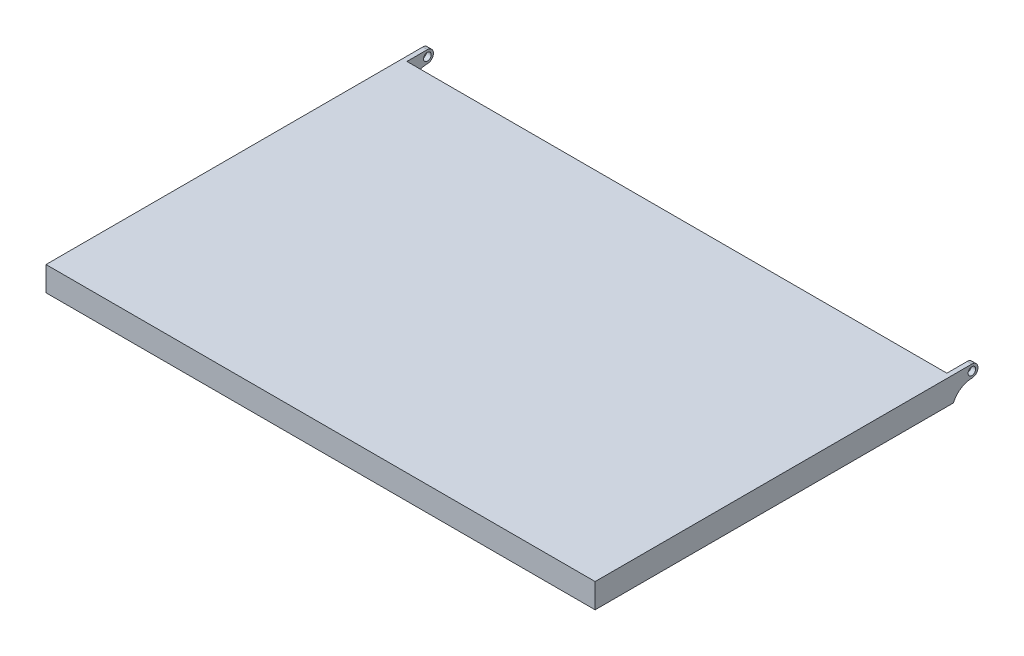
ISO-10303-21;
HEADER;
FILE_DESCRIPTION(('STEP AP214'),'2;1');
FILE_NAME('part.step','',(''),(''),'','','');
FILE_SCHEMA(('AUTOMOTIVE_DESIGN { 1 0 10303 214 1 1 1 1 }'));
ENDSEC;
DATA;
#1=APPLICATION_CONTEXT('core data for automotive mechanical design processes');
#2=APPLICATION_PROTOCOL_DEFINITION('international standard','automotive_design',2000,#1);
#3=PRODUCT_CONTEXT('',#1,'mechanical');
#4=PRODUCT('Part','Part','',(#3));
#5=PRODUCT_RELATED_PRODUCT_CATEGORY('part','',(#4));
#6=PRODUCT_DEFINITION_FORMATION('','',#4);
#7=PRODUCT_DEFINITION_CONTEXT('part definition',#1,'design');
#8=PRODUCT_DEFINITION('design','',#6,#7);
#9=PRODUCT_DEFINITION_SHAPE('','',#8);
#10=(LENGTH_UNIT() NAMED_UNIT(*) SI_UNIT(.MILLI.,.METRE.));
#11=(NAMED_UNIT(*) PLANE_ANGLE_UNIT() SI_UNIT($,.RADIAN.));
#12=(NAMED_UNIT(*) SI_UNIT($,.STERADIAN.) SOLID_ANGLE_UNIT());
#13=UNCERTAINTY_MEASURE_WITH_UNIT(LENGTH_MEASURE(1.E-05),#10,'distance_accuracy_value','');
#14=(GEOMETRIC_REPRESENTATION_CONTEXT(3) GLOBAL_UNCERTAINTY_ASSIGNED_CONTEXT((#13)) GLOBAL_UNIT_ASSIGNED_CONTEXT((#10,
#11,#12)) REPRESENTATION_CONTEXT('',''));
#15=CARTESIAN_POINT('',(0.,0.,0.));
#16=DIRECTION('',(0.,0.,1.));
#17=DIRECTION('',(1.,0.,0.));
#18=AXIS2_PLACEMENT_3D('',#15,#16,#17);
#19=CARTESIAN_POINT('',(42.3333333333333,25.4,-411.818666666667));
#20=DIRECTION('',(0.,0.,1.));
#21=DIRECTION('',(1.,0.,0.));
#22=AXIS2_PLACEMENT_3D('',#19,#20,#21);
#23=PLANE('',#22);
#24=DIRECTION('',(0.,-1.,0.));
#25=VECTOR('',#24,1.);
#26=CARTESIAN_POINT('',(47.0958333333333,0.,-411.818666666667));
#27=LINE('',#26,#25);
#28=CARTESIAN_POINT('',(47.0958333333333,25.4,-411.818666666667));
#29=VERTEX_POINT('',#28);
#30=CARTESIAN_POINT('',(47.0958333333333,0.,-411.818666666667));
#31=VERTEX_POINT('',#30);
#32=EDGE_CURVE('E168',#29,#31,#27,.T.);
#33=ORIENTED_EDGE('',*,*,#32,.F.);
#34=DIRECTION('',(-1.,0.,0.));
#35=VECTOR('',#34,1.);
#36=CARTESIAN_POINT('',(42.3333333333333,25.4,-411.818666666667));
#37=LINE('',#36,#35);
#38=CARTESIAN_POINT('',(606.954166666667,25.4,-411.818666666667));
#39=VERTEX_POINT('',#38);
#40=EDGE_CURVE('E174',#39,#29,#37,.T.);
#41=ORIENTED_EDGE('',*,*,#40,.F.);
#42=DIRECTION('',(0.,-1.,0.));
#43=VECTOR('',#42,1.);
#44=CARTESIAN_POINT('',(606.954166666667,0.,-411.818666666667));
#45=LINE('',#44,#43);
#46=CARTESIAN_POINT('',(606.954166666667,0.,-411.818666666667));
#47=VERTEX_POINT('',#46);
#48=EDGE_CURVE('E201',#39,#47,#45,.T.);
#49=ORIENTED_EDGE('',*,*,#48,.T.);
#50=DIRECTION('',(-1.,0.,0.));
#51=VECTOR('',#50,1.);
#52=CARTESIAN_POINT('',(42.3333333333333,0.,-411.818666666667));
#53=LINE('',#52,#51);
#54=EDGE_CURVE('E255',#47,#31,#53,.T.);
#55=ORIENTED_EDGE('',*,*,#54,.T.);
#56=EDGE_LOOP('',(#33,#41,#49,#55));
#57=FACE_BOUND('',#56,.T.);
#58=ADVANCED_FACE('F44',(#57),#23,.F.);
#59=CARTESIAN_POINT('',(0.,0.,0.));
#60=DIRECTION('',(0.,-1.,0.));
#61=DIRECTION('',(0.,0.,-1.));
#62=AXIS2_PLACEMENT_3D('',#59,#60,#61);
#63=PLANE('',#62);
#64=DIRECTION('',(0.,0.,1.));
#65=VECTOR('',#64,1.);
#66=CARTESIAN_POINT('',(42.3333333333333,0.,-42.3333333333333));
#67=LINE('',#66,#65);
#68=CARTESIAN_POINT('',(42.3333333333333,0.,-413.933666666667));
#69=VERTEX_POINT('',#68);
#70=CARTESIAN_POINT('',(42.3333333333333,0.,-42.3333333333333));
#71=VERTEX_POINT('',#70);
#72=EDGE_CURVE('E227',#69,#71,#67,.T.);
#73=ORIENTED_EDGE('',*,*,#72,.F.);
#74=DIRECTION('',(-1.,0.,0.));
#75=VECTOR('',#74,1.);
#76=CARTESIAN_POINT('',(47.0958333333333,0.,-413.933666666667));
#77=LINE('',#76,#75);
#78=CARTESIAN_POINT('',(47.0958333333333,0.,-413.933666666667));
#79=VERTEX_POINT('',#78);
#80=EDGE_CURVE('E188',#79,#69,#77,.T.);
#81=ORIENTED_EDGE('',*,*,#80,.F.);
#82=DIRECTION('',(0.,0.,-1.));
#83=VECTOR('',#82,1.);
#84=CARTESIAN_POINT('',(47.0958333333333,0.,-411.818666666667));
#85=LINE('',#84,#83);
#86=EDGE_CURVE('E183',#31,#79,#85,.T.);
#87=ORIENTED_EDGE('',*,*,#86,.F.);
#88=ORIENTED_EDGE('',*,*,#54,.F.);
#89=DIRECTION('',(0.,0.,-1.));
#90=VECTOR('',#89,1.);
#91=CARTESIAN_POINT('',(606.954166666667,0.,-411.818666666667));
#92=LINE('',#91,#90);
#93=CARTESIAN_POINT('',(606.954166666667,0.,-413.933666666667));
#94=VERTEX_POINT('',#93);
#95=EDGE_CURVE('E59',#47,#94,#92,.T.);
#96=ORIENTED_EDGE('',*,*,#95,.T.);
#97=DIRECTION('',(1.,0.,0.));
#98=VECTOR('',#97,1.);
#99=CARTESIAN_POINT('',(606.954166666667,0.,-413.933666666667));
#100=LINE('',#99,#98);
#101=CARTESIAN_POINT('',(611.716666666667,0.,-413.933666666667));
#102=VERTEX_POINT('',#101);
#103=EDGE_CURVE('E211',#94,#102,#100,.T.);
#104=ORIENTED_EDGE('',*,*,#103,.T.);
#105=DIRECTION('',(0.,0.,-1.));
#106=VECTOR('',#105,1.);
#107=CARTESIAN_POINT('',(611.716666666667,0.,-42.3333333333333));
#108=LINE('',#107,#106);
#109=CARTESIAN_POINT('',(611.716666666667,0.,-42.3333333333333));
#110=VERTEX_POINT('',#109);
#111=EDGE_CURVE('E264',#110,#102,#108,.T.);
#112=ORIENTED_EDGE('',*,*,#111,.F.);
#113=DIRECTION('',(1.,0.,0.));
#114=VECTOR('',#113,1.);
#115=CARTESIAN_POINT('',(42.3333333333333,0.,-42.3333333333333));
#116=LINE('',#115,#114);
#117=EDGE_CURVE('E262',#71,#110,#116,.T.);
#118=ORIENTED_EDGE('',*,*,#117,.F.);
#119=EDGE_LOOP('',(#73,#81,#87,#88,#96,#104,#112,#118));
#120=FACE_BOUND('',#119,.T.);
#121=DIRECTION('',(-1.,0.,0.));
#122=VECTOR('',#121,1.);
#123=CARTESIAN_POINT('',(0.,0.,-408.643666666667));
#124=LINE('',#123,#122);
#125=CARTESIAN_POINT('',(608.541666666667,0.,-408.643666666667));
#126=VERTEX_POINT('',#125);
#127=CARTESIAN_POINT('',(45.5083333333333,0.,-408.643666666667));
#128=VERTEX_POINT('',#127);
#129=EDGE_CURVE('E233',#126,#128,#124,.T.);
#130=ORIENTED_EDGE('',*,*,#129,.T.);
#131=DIRECTION('',(0.,0.,1.));
#132=VECTOR('',#131,1.);
#133=CARTESIAN_POINT('',(45.5083333333333,0.,0.));
#134=LINE('',#133,#132);
#135=CARTESIAN_POINT('',(45.5083333333333,0.,-45.5083333333333));
#136=VERTEX_POINT('',#135);
#137=EDGE_CURVE('E219',#128,#136,#134,.T.);
#138=ORIENTED_EDGE('',*,*,#137,.T.);
#139=DIRECTION('',(1.,0.,0.));
#140=VECTOR('',#139,1.);
#141=CARTESIAN_POINT('',(0.,0.,-45.5083333333333));
#142=LINE('',#141,#140);
#143=CARTESIAN_POINT('',(608.541666666667,0.,-45.5083333333333));
#144=VERTEX_POINT('',#143);
#145=EDGE_CURVE('E246',#136,#144,#142,.T.);
#146=ORIENTED_EDGE('',*,*,#145,.T.);
#147=DIRECTION('',(0.,0.,-1.));
#148=VECTOR('',#147,1.);
#149=CARTESIAN_POINT('',(608.541666666667,0.,0.));
#150=LINE('',#149,#148);
#151=EDGE_CURVE('E67',#144,#126,#150,.T.);
#152=ORIENTED_EDGE('',*,*,#151,.T.);
#153=EDGE_LOOP('',(#130,#138,#146,#152));
#154=FACE_BOUND('',#153,.T.);
#155=ADVANCED_FACE('F276',(#120,#154),#63,.T.);
#156=CARTESIAN_POINT('',(42.3333333333333,25.4,-42.3333333333333));
#157=DIRECTION('',(1.,0.,0.));
#158=DIRECTION('',(0.,0.,-1.));
#159=AXIS2_PLACEMENT_3D('',#156,#157,#158);
#160=PLANE('',#159);
#161=ORIENTED_EDGE('',*,*,#72,.T.);
#162=DIRECTION('',(0.,-1.,0.));
#163=VECTOR('',#162,1.);
#164=CARTESIAN_POINT('',(42.3333333333333,25.4,-42.3333333333333));
#165=LINE('',#164,#163);
#166=CARTESIAN_POINT('',(42.3333333333333,25.4,-42.3333333333333));
#167=VERTEX_POINT('',#166);
#168=EDGE_CURVE('E11',#167,#71,#165,.T.);
#169=ORIENTED_EDGE('',*,*,#168,.F.);
#170=DIRECTION('',(0.,0.,1.));
#171=VECTOR('',#170,1.);
#172=CARTESIAN_POINT('',(42.3333333333333,25.4,-42.3333333333333));
#173=LINE('',#172,#171);
#174=CARTESIAN_POINT('',(42.3333333333333,25.4,-432.983666666667));
#175=VERTEX_POINT('',#174);
#176=EDGE_CURVE('E252',#175,#167,#173,.T.);
#177=ORIENTED_EDGE('',*,*,#176,.F.);
#178=CARTESIAN_POINT('',(42.3333333333333,19.05,-432.983666666667));
#179=DIRECTION('',(1.,0.,0.));
#180=DIRECTION('',(0.,0.,-1.));
#181=AXIS2_PLACEMENT_3D('',#178,#179,#180);
#182=CIRCLE('',#181,6.35);
#183=CARTESIAN_POINT('',(42.3333333333333,12.7,-432.983666666667));
#184=VERTEX_POINT('',#183);
#185=EDGE_CURVE('E164',#184,#175,#182,.T.);
#186=ORIENTED_EDGE('',*,*,#185,.F.);
#187=CARTESIAN_POINT('',(42.3333333333333,-7.93750000000025,-432.983666666667));
#188=DIRECTION('',(-1.,0.,0.));
#189=DIRECTION('',(0.,0.,1.));
#190=AXIS2_PLACEMENT_3D('',#187,#188,#189);
#191=CIRCLE('',#190,20.6375000000003);
#192=EDGE_CURVE('E175',#69,#184,#191,.T.);
#193=ORIENTED_EDGE('',*,*,#192,.F.);
#194=EDGE_LOOP('',(#161,#169,#177,#186,#193));
#195=FACE_BOUND('',#194,.T.);
#196=CARTESIAN_POINT('',(42.3333333333333,19.05,-432.983666666667));
#197=DIRECTION('',(1.,0.,0.));
#198=DIRECTION('',(0.,0.,-1.));
#199=AXIS2_PLACEMENT_3D('',#196,#197,#198);
#200=CIRCLE('',#199,3.96875000000005);
#201=CARTESIAN_POINT('',(42.3333333333333,19.05,-429.014916666667));
#202=VERTEX_POINT('',#201);
#203=EDGE_CURVE('E179',#202,#202,#200,.T.);
#204=ORIENTED_EDGE('',*,*,#203,.T.);
#205=EDGE_LOOP('',(#204));
#206=FACE_BOUND('',#205,.T.);
#207=ADVANCED_FACE('F46',(#195,#206),#160,.F.);
#208=CARTESIAN_POINT('',(42.3333333333333,25.4,-42.3333333333333));
#209=DIRECTION('',(0.,0.,-1.));
#210=DIRECTION('',(-1.,0.,0.));
#211=AXIS2_PLACEMENT_3D('',#208,#209,#210);
#212=PLANE('',#211);
#213=ORIENTED_EDGE('',*,*,#117,.T.);
#214=DIRECTION('',(0.,-1.,0.));
#215=VECTOR('',#214,1.);
#216=CARTESIAN_POINT('',(611.716666666667,25.4,-42.3333333333333));
#217=LINE('',#216,#215);
#218=CARTESIAN_POINT('',(611.716666666667,25.4,-42.3333333333333));
#219=VERTEX_POINT('',#218);
#220=EDGE_CURVE('E52',#219,#110,#217,.T.);
#221=ORIENTED_EDGE('',*,*,#220,.F.);
#222=DIRECTION('',(1.,0.,0.));
#223=VECTOR('',#222,1.);
#224=CARTESIAN_POINT('',(42.3333333333333,25.4,-42.3333333333333));
#225=LINE('',#224,#223);
#226=EDGE_CURVE('E254',#167,#219,#225,.T.);
#227=ORIENTED_EDGE('',*,*,#226,.F.);
#228=ORIENTED_EDGE('',*,*,#168,.T.);
#229=EDGE_LOOP('',(#213,#221,#227,#228));
#230=FACE_BOUND('',#229,.T.);
#231=ADVANCED_FACE('F297',(#230),#212,.F.);
#232=CARTESIAN_POINT('',(611.716666666667,25.4,-42.3333333333333));
#233=DIRECTION('',(-1.,0.,0.));
#234=DIRECTION('',(0.,0.,1.));
#235=AXIS2_PLACEMENT_3D('',#232,#233,#234);
#236=PLANE('',#235);
#237=ORIENTED_EDGE('',*,*,#111,.T.);
#238=CARTESIAN_POINT('',(611.716666666667,-7.93750000000025,-432.983666666667));
#239=DIRECTION('',(-1.,0.,0.));
#240=DIRECTION('',(0.,0.,1.));
#241=AXIS2_PLACEMENT_3D('',#238,#239,#240);
#242=CIRCLE('',#241,20.6375000000003);
#243=CARTESIAN_POINT('',(611.716666666667,12.7,-432.983666666667));
#244=VERTEX_POINT('',#243);
#245=EDGE_CURVE('E196',#102,#244,#242,.T.);
#246=ORIENTED_EDGE('',*,*,#245,.T.);
#247=CARTESIAN_POINT('',(611.716666666667,19.05,-432.983666666667));
#248=DIRECTION('',(1.,0.,0.));
#249=DIRECTION('',(0.,0.,-1.));
#250=AXIS2_PLACEMENT_3D('',#247,#248,#249);
#251=CIRCLE('',#250,6.35);
#252=CARTESIAN_POINT('',(611.716666666667,25.4,-432.983666666667));
#253=VERTEX_POINT('',#252);
#254=EDGE_CURVE('E202',#244,#253,#251,.T.);
#255=ORIENTED_EDGE('',*,*,#254,.T.);
#256=DIRECTION('',(0.,0.,-1.));
#257=VECTOR('',#256,1.);
#258=CARTESIAN_POINT('',(611.716666666667,25.4,-42.3333333333333));
#259=LINE('',#258,#257);
#260=EDGE_CURVE('E257',#219,#253,#259,.T.);
#261=ORIENTED_EDGE('',*,*,#260,.F.);
#262=ORIENTED_EDGE('',*,*,#220,.T.);
#263=EDGE_LOOP('',(#237,#246,#255,#261,#262));
#264=FACE_BOUND('',#263,.T.);
#265=CARTESIAN_POINT('',(611.716666666667,19.05,-432.983666666667));
#266=DIRECTION('',(1.,0.,0.));
#267=DIRECTION('',(0.,0.,-1.));
#268=AXIS2_PLACEMENT_3D('',#265,#266,#267);
#269=CIRCLE('',#268,3.96875000000005);
#270=CARTESIAN_POINT('',(611.716666666667,19.05,-436.952416666667));
#271=VERTEX_POINT('',#270);
#272=EDGE_CURVE('E191',#271,#271,#269,.T.);
#273=ORIENTED_EDGE('',*,*,#272,.F.);
#274=EDGE_LOOP('',(#273));
#275=FACE_BOUND('',#274,.T.);
#276=ADVANCED_FACE('F272',(#264,#275),#236,.F.);
#277=CARTESIAN_POINT('',(0.,25.4,0.));
#278=DIRECTION('',(0.,-1.,0.));
#279=DIRECTION('',(0.,0.,-1.));
#280=AXIS2_PLACEMENT_3D('',#277,#278,#279);
#281=PLANE('',#280);
#282=ORIENTED_EDGE('',*,*,#176,.T.);
#283=ORIENTED_EDGE('',*,*,#226,.T.);
#284=ORIENTED_EDGE('',*,*,#260,.T.);
#285=DIRECTION('',(1.,0.,0.));
#286=VECTOR('',#285,1.);
#287=CARTESIAN_POINT('',(606.954166666667,25.4,-432.983666666667));
#288=LINE('',#287,#286);
#289=CARTESIAN_POINT('',(606.954166666667,25.4,-432.983666666667));
#290=VERTEX_POINT('',#289);
#291=EDGE_CURVE('E216',#290,#253,#288,.T.);
#292=ORIENTED_EDGE('',*,*,#291,.F.);
#293=DIRECTION('',(0.,0.,1.));
#294=VECTOR('',#293,1.);
#295=CARTESIAN_POINT('',(606.954166666667,25.4,-411.818666666667));
#296=LINE('',#295,#294);
#297=EDGE_CURVE('E199',#290,#39,#296,.T.);
#298=ORIENTED_EDGE('',*,*,#297,.T.);
#299=ORIENTED_EDGE('',*,*,#40,.T.);
#300=DIRECTION('',(0.,0.,1.));
#301=VECTOR('',#300,1.);
#302=CARTESIAN_POINT('',(47.0958333333333,25.4,-411.818666666667));
#303=LINE('',#302,#301);
#304=CARTESIAN_POINT('',(47.0958333333333,25.4,-432.983666666667));
#305=VERTEX_POINT('',#304);
#306=EDGE_CURVE('E151',#305,#29,#303,.T.);
#307=ORIENTED_EDGE('',*,*,#306,.F.);
#308=DIRECTION('',(-1.,0.,0.));
#309=VECTOR('',#308,1.);
#310=CARTESIAN_POINT('',(47.0958333333333,25.4,-432.983666666667));
#311=LINE('',#310,#309);
#312=EDGE_CURVE('E161',#305,#175,#311,.T.);
#313=ORIENTED_EDGE('',*,*,#312,.T.);
#314=EDGE_LOOP('',(#282,#283,#284,#292,#298,#299,#307,#313));
#315=FACE_BOUND('',#314,.T.);
#316=ADVANCED_FACE('F171',(#315),#281,.F.);
#317=CARTESIAN_POINT('',(45.5083333333333,25.4,-42.3333333333333));
#318=DIRECTION('',(1.,0.,0.));
#319=DIRECTION('',(0.,0.,-1.));
#320=AXIS2_PLACEMENT_3D('',#317,#318,#319);
#321=PLANE('',#320);
#322=ORIENTED_EDGE('',*,*,#137,.F.);
#323=DIRECTION('',(0.,-1.,0.));
#324=VECTOR('',#323,1.);
#325=CARTESIAN_POINT('',(45.5083333333333,25.4,-408.643666666667));
#326=LINE('',#325,#324);
#327=CARTESIAN_POINT('',(45.5083333333333,22.225,-408.643666666667));
#328=VERTEX_POINT('',#327);
#329=EDGE_CURVE('E234',#328,#128,#326,.T.);
#330=ORIENTED_EDGE('',*,*,#329,.F.);
#331=DIRECTION('',(0.,0.,1.));
#332=VECTOR('',#331,1.);
#333=CARTESIAN_POINT('',(45.5083333333333,22.225,0.));
#334=LINE('',#333,#332);
#335=CARTESIAN_POINT('',(45.5083333333333,22.225,-45.5083333333333));
#336=VERTEX_POINT('',#335);
#337=EDGE_CURVE('E229',#328,#336,#334,.T.);
#338=ORIENTED_EDGE('',*,*,#337,.T.);
#339=DIRECTION('',(0.,-1.,0.));
#340=VECTOR('',#339,1.);
#341=CARTESIAN_POINT('',(45.5083333333333,25.4,-45.5083333333333));
#342=LINE('',#341,#340);
#343=EDGE_CURVE('E224',#336,#136,#342,.T.);
#344=ORIENTED_EDGE('',*,*,#343,.T.);
#345=EDGE_LOOP('',(#322,#330,#338,#344));
#346=FACE_BOUND('',#345,.T.);
#347=ADVANCED_FACE('F313',(#346),#321,.T.);
#348=CARTESIAN_POINT('',(42.3333333333333,25.4,-45.5083333333333));
#349=DIRECTION('',(0.,0.,-1.));
#350=DIRECTION('',(-1.,0.,0.));
#351=AXIS2_PLACEMENT_3D('',#348,#349,#350);
#352=PLANE('',#351);
#353=ORIENTED_EDGE('',*,*,#145,.F.);
#354=ORIENTED_EDGE('',*,*,#343,.F.);
#355=DIRECTION('',(1.,0.,0.));
#356=VECTOR('',#355,1.);
#357=CARTESIAN_POINT('',(0.,22.225,-45.5083333333333));
#358=LINE('',#357,#356);
#359=CARTESIAN_POINT('',(608.541666666667,22.225,-45.5083333333333));
#360=VERTEX_POINT('',#359);
#361=EDGE_CURVE('E232',#336,#360,#358,.T.);
#362=ORIENTED_EDGE('',*,*,#361,.T.);
#363=DIRECTION('',(0.,-1.,0.));
#364=VECTOR('',#363,1.);
#365=CARTESIAN_POINT('',(608.541666666667,25.4,-45.5083333333333));
#366=LINE('',#365,#364);
#367=EDGE_CURVE('E228',#360,#144,#366,.T.);
#368=ORIENTED_EDGE('',*,*,#367,.T.);
#369=EDGE_LOOP('',(#353,#354,#362,#368));
#370=FACE_BOUND('',#369,.T.);
#371=ADVANCED_FACE('F325',(#370),#352,.T.);
#372=CARTESIAN_POINT('',(608.541666666667,25.4,-42.3333333333333));
#373=DIRECTION('',(-1.,0.,0.));
#374=DIRECTION('',(0.,0.,1.));
#375=AXIS2_PLACEMENT_3D('',#372,#373,#374);
#376=PLANE('',#375);
#377=ORIENTED_EDGE('',*,*,#151,.F.);
#378=ORIENTED_EDGE('',*,*,#367,.F.);
#379=DIRECTION('',(0.,0.,-1.));
#380=VECTOR('',#379,1.);
#381=CARTESIAN_POINT('',(608.541666666667,22.225,0.));
#382=LINE('',#381,#380);
#383=CARTESIAN_POINT('',(608.541666666667,22.225,-408.643666666667));
#384=VERTEX_POINT('',#383);
#385=EDGE_CURVE('E240',#360,#384,#382,.T.);
#386=ORIENTED_EDGE('',*,*,#385,.T.);
#387=DIRECTION('',(0.,-1.,0.));
#388=VECTOR('',#387,1.);
#389=CARTESIAN_POINT('',(608.541666666667,25.4,-408.643666666667));
#390=LINE('',#389,#388);
#391=EDGE_CURVE('E236',#384,#126,#390,.T.);
#392=ORIENTED_EDGE('',*,*,#391,.T.);
#393=EDGE_LOOP('',(#377,#378,#386,#392));
#394=FACE_BOUND('',#393,.T.);
#395=ADVANCED_FACE('F321',(#394),#376,.T.);
#396=CARTESIAN_POINT('',(42.3333333333333,25.4,-408.643666666667));
#397=DIRECTION('',(0.,0.,1.));
#398=DIRECTION('',(1.,0.,0.));
#399=AXIS2_PLACEMENT_3D('',#396,#397,#398);
#400=PLANE('',#399);
#401=ORIENTED_EDGE('',*,*,#129,.F.);
#402=ORIENTED_EDGE('',*,*,#391,.F.);
#403=DIRECTION('',(-1.,0.,0.));
#404=VECTOR('',#403,1.);
#405=CARTESIAN_POINT('',(0.,22.225,-408.643666666667));
#406=LINE('',#405,#404);
#407=EDGE_CURVE('E237',#384,#328,#406,.T.);
#408=ORIENTED_EDGE('',*,*,#407,.T.);
#409=ORIENTED_EDGE('',*,*,#329,.T.);
#410=EDGE_LOOP('',(#401,#402,#408,#409));
#411=FACE_BOUND('',#410,.T.);
#412=ADVANCED_FACE('F317',(#411),#400,.T.);
#413=CARTESIAN_POINT('',(0.,22.225,0.));
#414=DIRECTION('',(0.,-1.,0.));
#415=DIRECTION('',(0.,0.,-1.));
#416=AXIS2_PLACEMENT_3D('',#413,#414,#415);
#417=PLANE('',#416);
#418=ORIENTED_EDGE('',*,*,#337,.F.);
#419=ORIENTED_EDGE('',*,*,#407,.F.);
#420=ORIENTED_EDGE('',*,*,#385,.F.);
#421=ORIENTED_EDGE('',*,*,#361,.F.);
#422=EDGE_LOOP('',(#418,#419,#420,#421));
#423=FACE_BOUND('',#422,.T.);
#424=ADVANCED_FACE('F314',(#423),#417,.T.);
#425=CARTESIAN_POINT('',(606.954166666667,19.05,-432.983666666667));
#426=DIRECTION('',(1.,0.,0.));
#427=DIRECTION('',(0.,0.,-1.));
#428=AXIS2_PLACEMENT_3D('',#425,#426,#427);
#429=CYLINDRICAL_SURFACE('',#428,6.35);
#430=ORIENTED_EDGE('',*,*,#254,.F.);
#431=DIRECTION('',(1.,0.,0.));
#432=VECTOR('',#431,1.);
#433=CARTESIAN_POINT('',(606.954166666667,12.7,-432.983666666667));
#434=LINE('',#433,#432);
#435=CARTESIAN_POINT('',(606.954166666667,12.7,-432.983666666667));
#436=VERTEX_POINT('',#435);
#437=EDGE_CURVE('E220',#436,#244,#434,.T.);
#438=ORIENTED_EDGE('',*,*,#437,.F.);
#439=CARTESIAN_POINT('',(606.954166666667,19.05,-432.983666666667));
#440=DIRECTION('',(1.,0.,0.));
#441=DIRECTION('',(0.,0.,-1.));
#442=AXIS2_PLACEMENT_3D('',#439,#440,#441);
#443=CIRCLE('',#442,6.35);
#444=EDGE_CURVE('E208',#436,#290,#443,.T.);
#445=ORIENTED_EDGE('',*,*,#444,.T.);
#446=ORIENTED_EDGE('',*,*,#291,.T.);
#447=EDGE_LOOP('',(#430,#438,#445,#446));
#448=FACE_BOUND('',#447,.T.);
#449=ADVANCED_FACE('F284',(#448),#429,.T.);
#450=CARTESIAN_POINT('',(606.954166666667,-7.93750000000025,-432.983666666667));
#451=DIRECTION('',(1.,0.,0.));
#452=DIRECTION('',(0.,0.,-1.));
#453=AXIS2_PLACEMENT_3D('',#450,#451,#452);
#454=CYLINDRICAL_SURFACE('',#453,20.6375000000003);
#455=ORIENTED_EDGE('',*,*,#245,.F.);
#456=ORIENTED_EDGE('',*,*,#103,.F.);
#457=CARTESIAN_POINT('',(606.954166666667,-7.93750000000025,-432.983666666667));
#458=DIRECTION('',(-1.,0.,0.));
#459=DIRECTION('',(0.,0.,1.));
#460=AXIS2_PLACEMENT_3D('',#457,#458,#459);
#461=CIRCLE('',#460,20.6375000000003);
#462=EDGE_CURVE('E205',#94,#436,#461,.T.);
#463=ORIENTED_EDGE('',*,*,#462,.T.);
#464=ORIENTED_EDGE('',*,*,#437,.T.);
#465=EDGE_LOOP('',(#455,#456,#463,#464));
#466=FACE_BOUND('',#465,.T.);
#467=ADVANCED_FACE('F281',(#466),#454,.F.);
#468=CARTESIAN_POINT('',(606.954166666667,19.05,-432.983666666667));
#469=DIRECTION('',(1.,0.,0.));
#470=DIRECTION('',(0.,0.,-1.));
#471=AXIS2_PLACEMENT_3D('',#468,#469,#470);
#472=PLANE('',#471);
#473=CARTESIAN_POINT('',(606.954166666667,19.05,-432.983666666667));
#474=DIRECTION('',(1.,0.,0.));
#475=DIRECTION('',(0.,0.,-1.));
#476=AXIS2_PLACEMENT_3D('',#473,#474,#475);
#477=CIRCLE('',#476,3.96875000000005);
#478=CARTESIAN_POINT('',(606.954166666667,19.05,-436.952416666667));
#479=VERTEX_POINT('',#478);
#480=EDGE_CURVE('E193',#479,#479,#477,.T.);
#481=ORIENTED_EDGE('',*,*,#480,.T.);
#482=EDGE_LOOP('',(#481));
#483=FACE_BOUND('',#482,.T.);
#484=ORIENTED_EDGE('',*,*,#297,.F.);
#485=ORIENTED_EDGE('',*,*,#444,.F.);
#486=ORIENTED_EDGE('',*,*,#462,.F.);
#487=ORIENTED_EDGE('',*,*,#95,.F.);
#488=ORIENTED_EDGE('',*,*,#48,.F.);
#489=EDGE_LOOP('',(#484,#485,#486,#487,#488));
#490=FACE_BOUND('',#489,.T.);
#491=ADVANCED_FACE('F287',(#483,#490),#472,.F.);
#492=CARTESIAN_POINT('',(606.954166666667,19.05,-432.983666666667));
#493=DIRECTION('',(1.,0.,0.));
#494=DIRECTION('',(0.,0.,-1.));
#495=AXIS2_PLACEMENT_3D('',#492,#493,#494);
#496=CYLINDRICAL_SURFACE('',#495,3.96875000000005);
#497=CARTESIAN_POINT('',(606.954166666667,19.05,-436.952416666667));
#498=CARTESIAN_POINT('',(607.003776041667,19.05,-436.952416666667));
#499=CARTESIAN_POINT('',(607.053385416667,19.05,-436.952416666667));
#500=CARTESIAN_POINT('',(607.152604166667,19.05,-436.952416666667));
#501=CARTESIAN_POINT('',(607.202213541667,19.05,-436.952416666667));
#502=CARTESIAN_POINT('',(607.301432291667,19.05,-436.952416666667));
#503=CARTESIAN_POINT('',(607.351041666667,19.05,-436.952416666667));
#504=CARTESIAN_POINT('',(607.450260416667,19.05,-436.952416666667));
#505=CARTESIAN_POINT('',(607.499869791667,19.05,-436.952416666667));
#506=CARTESIAN_POINT('',(607.599088541667,19.05,-436.952416666667));
#507=CARTESIAN_POINT('',(607.648697916667,19.05,-436.952416666667));
#508=CARTESIAN_POINT('',(607.747916666667,19.05,-436.952416666667));
#509=CARTESIAN_POINT('',(607.797526041667,19.05,-436.952416666667));
#510=CARTESIAN_POINT('',(607.896744791667,19.05,-436.952416666667));
#511=CARTESIAN_POINT('',(607.946354166667,19.05,-436.952416666667));
#512=CARTESIAN_POINT('',(608.045572916667,19.05,-436.952416666667));
#513=CARTESIAN_POINT('',(608.095182291667,19.05,-436.952416666667));
#514=CARTESIAN_POINT('',(608.194401041667,19.05,-436.952416666667));
#515=CARTESIAN_POINT('',(608.244010416667,19.05,-436.952416666667));
#516=CARTESIAN_POINT('',(608.343229166667,19.05,-436.952416666667));
#517=CARTESIAN_POINT('',(608.392838541667,19.05,-436.952416666667));
#518=CARTESIAN_POINT('',(608.492057291667,19.05,-436.952416666667));
#519=CARTESIAN_POINT('',(608.541666666667,19.05,-436.952416666667));
#520=CARTESIAN_POINT('',(608.640885416667,19.05,-436.952416666667));
#521=CARTESIAN_POINT('',(608.690494791667,19.05,-436.952416666667));
#522=CARTESIAN_POINT('',(608.789713541667,19.05,-436.952416666667));
#523=CARTESIAN_POINT('',(608.839322916667,19.05,-436.952416666667));
#524=CARTESIAN_POINT('',(608.938541666667,19.05,-436.952416666667));
#525=CARTESIAN_POINT('',(608.988151041667,19.05,-436.952416666667));
#526=CARTESIAN_POINT('',(609.087369791667,19.05,-436.952416666667));
#527=CARTESIAN_POINT('',(609.136979166667,19.05,-436.952416666667));
#528=CARTESIAN_POINT('',(609.236197916667,19.05,-436.952416666667));
#529=CARTESIAN_POINT('',(609.285807291667,19.05,-436.952416666667));
#530=CARTESIAN_POINT('',(609.385026041667,19.05,-436.952416666667));
#531=CARTESIAN_POINT('',(609.434635416667,19.05,-436.952416666667));
#532=CARTESIAN_POINT('',(609.533854166667,19.05,-436.952416666667));
#533=CARTESIAN_POINT('',(609.583463541667,19.05,-436.952416666667));
#534=CARTESIAN_POINT('',(609.682682291667,19.05,-436.952416666667));
#535=CARTESIAN_POINT('',(609.732291666667,19.05,-436.952416666667));
#536=CARTESIAN_POINT('',(609.831510416667,19.05,-436.952416666667));
#537=CARTESIAN_POINT('',(609.881119791667,19.05,-436.952416666667));
#538=CARTESIAN_POINT('',(609.980338541667,19.05,-436.952416666667));
#539=CARTESIAN_POINT('',(610.029947916667,19.05,-436.952416666667));
#540=CARTESIAN_POINT('',(610.129166666667,19.05,-436.952416666667));
#541=CARTESIAN_POINT('',(610.178776041667,19.05,-436.952416666667));
#542=CARTESIAN_POINT('',(610.277994791667,19.05,-436.952416666667));
#543=CARTESIAN_POINT('',(610.327604166667,19.05,-436.952416666667));
#544=CARTESIAN_POINT('',(610.426822916667,19.05,-436.952416666667));
#545=CARTESIAN_POINT('',(610.476432291667,19.05,-436.952416666667));
#546=CARTESIAN_POINT('',(610.575651041667,19.05,-436.952416666667));
#547=CARTESIAN_POINT('',(610.625260416667,19.05,-436.952416666667));
#548=CARTESIAN_POINT('',(610.724479166667,19.05,-436.952416666667));
#549=CARTESIAN_POINT('',(610.774088541667,19.05,-436.952416666667));
#550=CARTESIAN_POINT('',(610.873307291667,19.05,-436.952416666667));
#551=CARTESIAN_POINT('',(610.922916666667,19.05,-436.952416666667));
#552=CARTESIAN_POINT('',(611.022135416667,19.05,-436.952416666667));
#553=CARTESIAN_POINT('',(611.071744791667,19.05,-436.952416666667));
#554=CARTESIAN_POINT('',(611.170963541667,19.05,-436.952416666667));
#555=CARTESIAN_POINT('',(611.220572916667,19.05,-436.952416666667));
#556=CARTESIAN_POINT('',(611.319791666667,19.05,-436.952416666667));
#557=CARTESIAN_POINT('',(611.369401041667,19.05,-436.952416666667));
#558=CARTESIAN_POINT('',(611.468619791667,19.05,-436.952416666667));
#559=CARTESIAN_POINT('',(611.518229166667,19.05,-436.952416666667));
#560=CARTESIAN_POINT('',(611.617447916667,19.05,-436.952416666667));
#561=CARTESIAN_POINT('',(611.667057291667,19.05,-436.952416666667));
#562=CARTESIAN_POINT('',(611.716666666667,19.05,-436.952416666667));
#563=B_SPLINE_CURVE_WITH_KNOTS('',3,(#497,#498,#499,#500,#501,#502,#503,#504,#505,#506,#507,
#508,#509,#510,#511,#512,#513,#514,#515,#516,#517,#518,#519,#520,#521,#522,#523,#524,#525,#526,
#527,#528,#529,#530,#531,#532,#533,#534,#535,#536,#537,#538,#539,#540,#541,#542,#543,#544,#545,
#546,#547,#548,#549,#550,#551,#552,#553,#554,#555,#556,#557,#558,#559,#560,#561,#562),
.UNSPECIFIED.,.F.,.F.,(4,2,2,2,2,2,2,2,2,2,2,2,2,2,2,2,2,2,2,2,2,2,2,2,2,2,2,2,2,2,2,2,4),(0.,
0.148828124999945,0.297656249999889,0.446484374999945,0.595312499999889,0.744140624999945,
0.89296874999989,1.04179687499995,1.19062499999989,1.33945312499995,1.48828124999989,
1.63710937499995,1.78593749999989,1.93476562499995,2.08359374999989,2.23242187499995,
2.38124999999989,2.53007812499995,2.67890624999989,2.82773437499995,2.97656249999989,
3.12539062499995,3.27421874999989,3.42304687499995,3.57187499999989,3.72070312499995,
3.86953124999989,4.01835937499995,4.16718749999989,4.31601562499995,4.46484374999989,
4.61367187499995,4.76249999999989),.UNSPECIFIED.);
#564=EDGE_CURVE('BSEAM338',#479,#271,#563,.T.);
#565=ORIENTED_EDGE('',*,*,#480,.F.);
#566=ORIENTED_EDGE('',*,*,#272,.T.);
#567=ORIENTED_EDGE('',*,*,#564,.T.);
#568=ORIENTED_EDGE('',*,*,#564,.F.);
#569=EDGE_LOOP('',(#565,#567,#566,#568));
#570=FACE_BOUND('',#569,.T.);
#571=ADVANCED_FACE('F338',(#570),#496,.F.);
#572=CARTESIAN_POINT('',(47.0958333333333,19.05,-432.983666666667));
#573=DIRECTION('',(-1.,0.,0.));
#574=DIRECTION('',(0.,0.,-1.));
#575=AXIS2_PLACEMENT_3D('',#572,#573,#574);
#576=PLANE('',#575);
#577=ORIENTED_EDGE('',*,*,#306,.T.);
#578=ORIENTED_EDGE('',*,*,#32,.T.);
#579=ORIENTED_EDGE('',*,*,#86,.T.);
#580=CARTESIAN_POINT('',(47.0958333333333,-7.93750000000025,-432.983666666667));
#581=DIRECTION('',(-1.,0.,0.));
#582=DIRECTION('',(0.,0.,1.));
#583=AXIS2_PLACEMENT_3D('',#580,#581,#582);
#584=CIRCLE('',#583,20.6375000000003);
#585=CARTESIAN_POINT('',(47.0958333333333,12.7,-432.983666666667));
#586=VERTEX_POINT('',#585);
#587=EDGE_CURVE('E154',#79,#586,#584,.T.);
#588=ORIENTED_EDGE('',*,*,#587,.T.);
#589=CARTESIAN_POINT('',(47.0958333333333,19.05,-432.983666666667));
#590=DIRECTION('',(1.,0.,0.));
#591=DIRECTION('',(0.,0.,-1.));
#592=AXIS2_PLACEMENT_3D('',#589,#590,#591);
#593=CIRCLE('',#592,6.35);
#594=EDGE_CURVE('E146',#586,#305,#593,.T.);
#595=ORIENTED_EDGE('',*,*,#594,.T.);
#596=EDGE_LOOP('',(#577,#578,#579,#588,#595));
#597=FACE_BOUND('',#596,.T.);
#598=CARTESIAN_POINT('',(47.0958333333333,19.05,-432.983666666667));
#599=DIRECTION('',(1.,0.,0.));
#600=DIRECTION('',(0.,0.,-1.));
#601=AXIS2_PLACEMENT_3D('',#598,#599,#600);
#602=CIRCLE('',#601,3.96875000000005);
#603=CARTESIAN_POINT('',(47.0958333333333,19.05,-429.014916666667));
#604=VERTEX_POINT('',#603);
#605=EDGE_CURVE('E186',#604,#604,#602,.T.);
#606=ORIENTED_EDGE('',*,*,#605,.F.);
#607=EDGE_LOOP('',(#606));
#608=FACE_BOUND('',#607,.T.);
#609=ADVANCED_FACE('F148',(#597,#608),#576,.F.);
#610=CARTESIAN_POINT('',(47.0958333333333,-7.93750000000025,-432.983666666667));
#611=DIRECTION('',(-1.,0.,0.));
#612=DIRECTION('',(0.,0.,1.));
#613=AXIS2_PLACEMENT_3D('',#610,#611,#612);
#614=CYLINDRICAL_SURFACE('',#613,20.6375000000003);
#615=ORIENTED_EDGE('',*,*,#192,.T.);
#616=DIRECTION('',(-1.,0.,0.));
#617=VECTOR('',#616,1.);
#618=CARTESIAN_POINT('',(47.0958333333333,12.7,-432.983666666667));
#619=LINE('',#618,#617);
#620=EDGE_CURVE('E167',#586,#184,#619,.T.);
#621=ORIENTED_EDGE('',*,*,#620,.F.);
#622=ORIENTED_EDGE('',*,*,#587,.F.);
#623=ORIENTED_EDGE('',*,*,#80,.T.);
#624=EDGE_LOOP('',(#615,#621,#622,#623));
#625=FACE_BOUND('',#624,.T.);
#626=ADVANCED_FACE('F293',(#625),#614,.F.);
#627=CARTESIAN_POINT('',(47.0958333333333,19.05,-432.983666666667));
#628=DIRECTION('',(-1.,0.,0.));
#629=DIRECTION('',(0.,0.,1.));
#630=AXIS2_PLACEMENT_3D('',#627,#628,#629);
#631=CYLINDRICAL_SURFACE('',#630,6.35);
#632=ORIENTED_EDGE('',*,*,#185,.T.);
#633=ORIENTED_EDGE('',*,*,#312,.F.);
#634=ORIENTED_EDGE('',*,*,#594,.F.);
#635=ORIENTED_EDGE('',*,*,#620,.T.);
#636=EDGE_LOOP('',(#632,#633,#634,#635));
#637=FACE_BOUND('',#636,.T.);
#638=ADVANCED_FACE('F162',(#637),#631,.T.);
#639=CARTESIAN_POINT('',(47.0958333333333,19.05,-432.983666666667));
#640=DIRECTION('',(-1.,0.,0.));
#641=DIRECTION('',(0.,0.,1.));
#642=AXIS2_PLACEMENT_3D('',#639,#640,#641);
#643=CYLINDRICAL_SURFACE('',#642,3.96875000000005);
#644=CARTESIAN_POINT('',(47.0958333333333,19.05,-429.014916666667));
#645=CARTESIAN_POINT('',(47.0462239583333,19.05,-429.014916666667));
#646=CARTESIAN_POINT('',(46.9966145833333,19.05,-429.014916666667));
#647=CARTESIAN_POINT('',(46.8973958333333,19.05,-429.014916666667));
#648=CARTESIAN_POINT('',(46.8477864583333,19.05,-429.014916666667));
#649=CARTESIAN_POINT('',(46.7485677083333,19.05,-429.014916666667));
#650=CARTESIAN_POINT('',(46.6989583333333,19.05,-429.014916666667));
#651=CARTESIAN_POINT('',(46.5997395833333,19.05,-429.014916666667));
#652=CARTESIAN_POINT('',(46.5501302083333,19.05,-429.014916666667));
#653=CARTESIAN_POINT('',(46.4509114583333,19.05,-429.014916666667));
#654=CARTESIAN_POINT('',(46.4013020833333,19.05,-429.014916666667));
#655=CARTESIAN_POINT('',(46.3020833333333,19.05,-429.014916666667));
#656=CARTESIAN_POINT('',(46.2524739583333,19.05,-429.014916666667));
#657=CARTESIAN_POINT('',(46.1532552083333,19.05,-429.014916666667));
#658=CARTESIAN_POINT('',(46.1036458333333,19.05,-429.014916666667));
#659=CARTESIAN_POINT('',(46.0044270833333,19.05,-429.014916666667));
#660=CARTESIAN_POINT('',(45.9548177083333,19.05,-429.014916666667));
#661=CARTESIAN_POINT('',(45.8555989583333,19.05,-429.014916666667));
#662=CARTESIAN_POINT('',(45.8059895833333,19.05,-429.014916666667));
#663=CARTESIAN_POINT('',(45.7067708333333,19.05,-429.014916666667));
#664=CARTESIAN_POINT('',(45.6571614583333,19.05,-429.014916666667));
#665=CARTESIAN_POINT('',(45.5579427083333,19.05,-429.014916666667));
#666=CARTESIAN_POINT('',(45.5083333333333,19.05,-429.014916666667));
#667=CARTESIAN_POINT('',(45.4091145833333,19.05,-429.014916666667));
#668=CARTESIAN_POINT('',(45.3595052083333,19.05,-429.014916666667));
#669=CARTESIAN_POINT('',(45.2602864583333,19.05,-429.014916666667));
#670=CARTESIAN_POINT('',(45.2106770833333,19.05,-429.014916666667));
#671=CARTESIAN_POINT('',(45.1114583333333,19.05,-429.014916666667));
#672=CARTESIAN_POINT('',(45.0618489583333,19.05,-429.014916666667));
#673=CARTESIAN_POINT('',(44.9626302083333,19.05,-429.014916666667));
#674=CARTESIAN_POINT('',(44.9130208333333,19.05,-429.014916666667));
#675=CARTESIAN_POINT('',(44.8138020833333,19.05,-429.014916666667));
#676=CARTESIAN_POINT('',(44.7641927083333,19.05,-429.014916666667));
#677=CARTESIAN_POINT('',(44.6649739583333,19.05,-429.014916666667));
#678=CARTESIAN_POINT('',(44.6153645833333,19.05,-429.014916666667));
#679=CARTESIAN_POINT('',(44.5161458333333,19.05,-429.014916666667));
#680=CARTESIAN_POINT('',(44.4665364583333,19.05,-429.014916666667));
#681=CARTESIAN_POINT('',(44.3673177083333,19.05,-429.014916666667));
#682=CARTESIAN_POINT('',(44.3177083333333,19.05,-429.014916666667));
#683=CARTESIAN_POINT('',(44.2184895833333,19.05,-429.014916666667));
#684=CARTESIAN_POINT('',(44.1688802083333,19.05,-429.014916666667));
#685=CARTESIAN_POINT('',(44.0696614583333,19.05,-429.014916666667));
#686=CARTESIAN_POINT('',(44.0200520833333,19.05,-429.014916666667));
#687=CARTESIAN_POINT('',(43.9208333333333,19.05,-429.014916666667));
#688=CARTESIAN_POINT('',(43.8712239583333,19.05,-429.014916666667));
#689=CARTESIAN_POINT('',(43.7720052083333,19.05,-429.014916666667));
#690=CARTESIAN_POINT('',(43.7223958333333,19.05,-429.014916666667));
#691=CARTESIAN_POINT('',(43.6231770833333,19.05,-429.014916666667));
#692=CARTESIAN_POINT('',(43.5735677083333,19.05,-429.014916666667));
#693=CARTESIAN_POINT('',(43.4743489583333,19.05,-429.014916666667));
#694=CARTESIAN_POINT('',(43.4247395833333,19.05,-429.014916666667));
#695=CARTESIAN_POINT('',(43.3255208333333,19.05,-429.014916666667));
#696=CARTESIAN_POINT('',(43.2759114583333,19.05,-429.014916666667));
#697=CARTESIAN_POINT('',(43.1766927083333,19.05,-429.014916666667));
#698=CARTESIAN_POINT('',(43.1270833333333,19.05,-429.014916666667));
#699=CARTESIAN_POINT('',(43.0278645833333,19.05,-429.014916666667));
#700=CARTESIAN_POINT('',(42.9782552083333,19.05,-429.014916666667));
#701=CARTESIAN_POINT('',(42.8790364583333,19.05,-429.014916666667));
#702=CARTESIAN_POINT('',(42.8294270833333,19.05,-429.014916666667));
#703=CARTESIAN_POINT('',(42.7302083333333,19.05,-429.014916666667));
#704=CARTESIAN_POINT('',(42.6805989583333,19.05,-429.014916666667));
#705=CARTESIAN_POINT('',(42.5813802083333,19.05,-429.014916666667));
#706=CARTESIAN_POINT('',(42.5317708333333,19.05,-429.014916666667));
#707=CARTESIAN_POINT('',(42.4325520833333,19.05,-429.014916666667));
#708=CARTESIAN_POINT('',(42.3829427083333,19.05,-429.014916666667));
#709=CARTESIAN_POINT('',(42.3333333333333,19.05,-429.014916666667));
#710=B_SPLINE_CURVE_WITH_KNOTS('',3,(#644,#645,#646,#647,#648,#649,#650,#651,#652,#653,#654,
#655,#656,#657,#658,#659,#660,#661,#662,#663,#664,#665,#666,#667,#668,#669,#670,#671,#672,#673,
#674,#675,#676,#677,#678,#679,#680,#681,#682,#683,#684,#685,#686,#687,#688,#689,#690,#691,#692,
#693,#694,#695,#696,#697,#698,#699,#700,#701,#702,#703,#704,#705,#706,#707,#708,#709),
.UNSPECIFIED.,.F.,.F.,(4,2,2,2,2,2,2,2,2,2,2,2,2,2,2,2,2,2,2,2,2,2,2,2,2,2,2,2,2,2,2,2,4),(0.,
0.148828125,0.29765625,0.446484375,0.5953125,0.744140625,0.892968750000001,1.041796875,1.190625,
1.339453125,1.48828125,1.637109375,1.7859375,1.934765625,2.08359375,2.232421875,2.38125,
2.530078125,2.67890625,2.827734375,2.9765625,3.125390625,3.27421875,3.423046875,3.571875,
3.720703125,3.86953125,4.018359375,4.1671875,4.316015625,4.46484375,4.613671875,4.7625),.UNSPECIFIED.);
#711=EDGE_CURVE('BSEAM345',#604,#202,#710,.T.);
#712=ORIENTED_EDGE('',*,*,#605,.T.);
#713=ORIENTED_EDGE('',*,*,#203,.F.);
#714=ORIENTED_EDGE('',*,*,#711,.T.);
#715=ORIENTED_EDGE('',*,*,#711,.F.);
#716=EDGE_LOOP('',(#712,#714,#713,#715));
#717=FACE_BOUND('',#716,.T.);
#718=ADVANCED_FACE('F345',(#717),#643,.F.);
#719=CLOSED_SHELL('',(#58,#155,#207,#231,#276,#316,#347,#371,#395,#412,#424,#449,#467,#491,#571,
#609,#626,#638,#718));
#720=MANIFOLD_SOLID_BREP('B2',#719);
#721=ADVANCED_BREP_SHAPE_REPRESENTATION('',(#18,#720),#14);
#722=SHAPE_DEFINITION_REPRESENTATION(#9,#721);
ENDSEC;
END-ISO-10303-21;
